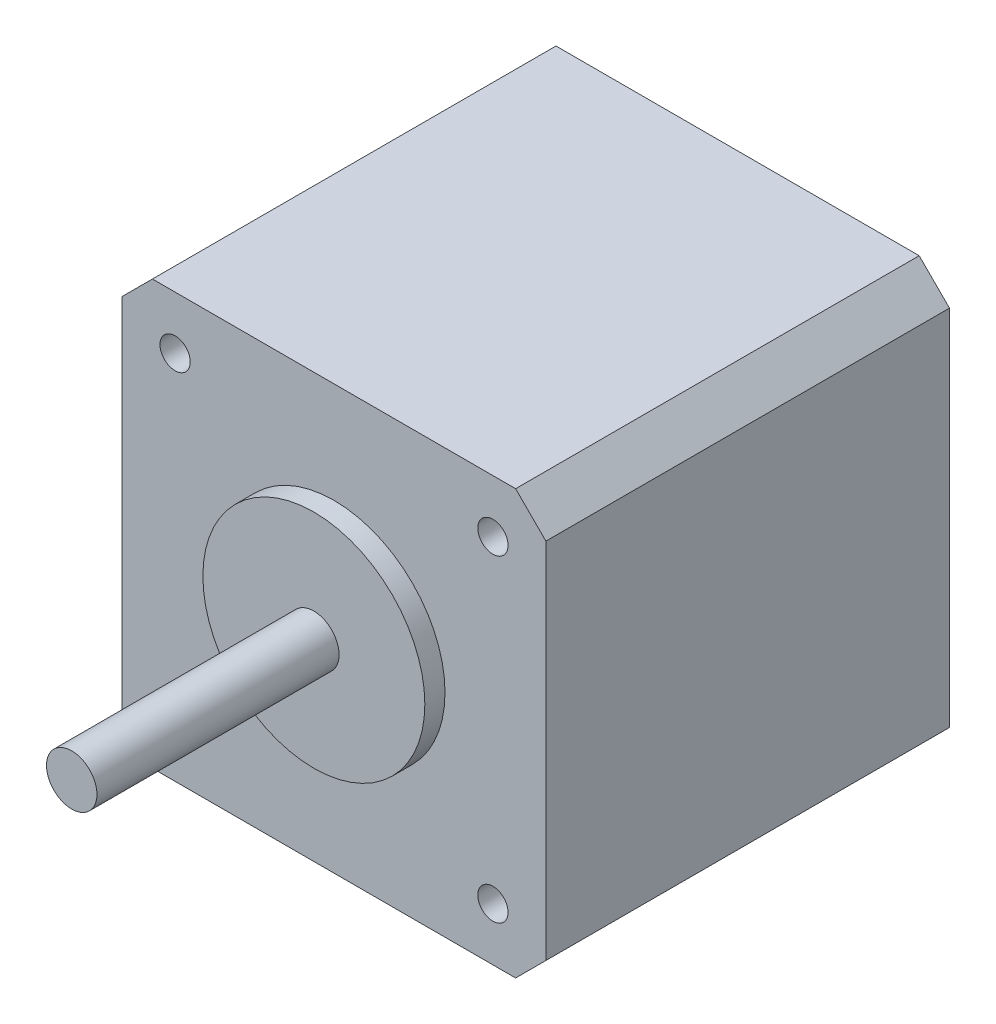
ISO-10303-21;
HEADER;
FILE_DESCRIPTION(('STEP AP214'),'2;1');
FILE_NAME('part.step','',(''),(''),'','','');
FILE_SCHEMA(('AUTOMOTIVE_DESIGN { 1 0 10303 214 1 1 1 1 }'));
ENDSEC;
DATA;
#1=APPLICATION_CONTEXT('core data for automotive mechanical design processes');
#2=APPLICATION_PROTOCOL_DEFINITION('international standard','automotive_design',2000,#1);
#3=PRODUCT_CONTEXT('',#1,'mechanical');
#4=PRODUCT('Part','Part','',(#3));
#5=PRODUCT_RELATED_PRODUCT_CATEGORY('part','',(#4));
#6=PRODUCT_DEFINITION_FORMATION('','',#4);
#7=PRODUCT_DEFINITION_CONTEXT('part definition',#1,'design');
#8=PRODUCT_DEFINITION('design','',#6,#7);
#9=PRODUCT_DEFINITION_SHAPE('','',#8);
#10=(LENGTH_UNIT() NAMED_UNIT(*) SI_UNIT(.MILLI.,.METRE.));
#11=(NAMED_UNIT(*) PLANE_ANGLE_UNIT() SI_UNIT($,.RADIAN.));
#12=(NAMED_UNIT(*) SI_UNIT($,.STERADIAN.) SOLID_ANGLE_UNIT());
#13=UNCERTAINTY_MEASURE_WITH_UNIT(LENGTH_MEASURE(1.E-05),#10,'distance_accuracy_value','');
#14=(GEOMETRIC_REPRESENTATION_CONTEXT(3) GLOBAL_UNCERTAINTY_ASSIGNED_CONTEXT((#13)) GLOBAL_UNIT_ASSIGNED_CONTEXT((#10,
#11,#12)) REPRESENTATION_CONTEXT('',''));
#15=CARTESIAN_POINT('',(0.,0.,0.));
#16=DIRECTION('',(0.,0.,1.));
#17=DIRECTION('',(1.,0.,0.));
#18=AXIS2_PLACEMENT_3D('',#15,#16,#17);
#19=CARTESIAN_POINT('',(0.,0.,42.));
#20=DIRECTION('',(0.,0.,1.));
#21=DIRECTION('',(1.,0.,0.));
#22=AXIS2_PLACEMENT_3D('',#19,#20,#21);
#23=PLANE('',#22);
#24=CARTESIAN_POINT('',(0.,0.,42.));
#25=DIRECTION('',(0.,0.,1.));
#26=DIRECTION('',(1.,0.,0.));
#27=AXIS2_PLACEMENT_3D('',#24,#25,#26);
#28=CIRCLE('',#27,11.);
#29=CARTESIAN_POINT('',(11.,0.,42.));
#30=VERTEX_POINT('',#29);
#31=EDGE_CURVE('E164',#30,#30,#28,.T.);
#32=ORIENTED_EDGE('',*,*,#31,.T.);
#33=EDGE_LOOP('',(#32));
#34=FACE_BOUND('',#33,.T.);
#35=CARTESIAN_POINT('',(0.,0.,42.));
#36=DIRECTION('',(0.,0.,1.));
#37=DIRECTION('',(1.,0.,0.));
#38=AXIS2_PLACEMENT_3D('',#35,#36,#37);
#39=CIRCLE('',#38,2.5);
#40=CARTESIAN_POINT('',(2.5,0.,42.));
#41=VERTEX_POINT('',#40);
#42=EDGE_CURVE('E178',#41,#41,#39,.T.);
#43=ORIENTED_EDGE('',*,*,#42,.F.);
#44=EDGE_LOOP('',(#43));
#45=FACE_BOUND('',#44,.T.);
#46=ADVANCED_FACE('F34',(#34,#45),#23,.T.);
#47=CARTESIAN_POINT('',(0.,0.,40.));
#48=DIRECTION('',(0.,0.,1.));
#49=DIRECTION('',(1.,0.,0.));
#50=AXIS2_PLACEMENT_3D('',#47,#48,#49);
#51=PLANE('',#50);
#52=CARTESIAN_POINT('',(15.75,-15.75,40.));
#53=DIRECTION('',(0.,0.,1.));
#54=DIRECTION('',(1.,0.,0.));
#55=AXIS2_PLACEMENT_3D('',#52,#53,#54);
#56=CIRCLE('',#55,1.5);
#57=CARTESIAN_POINT('',(17.25,-15.75,40.));
#58=VERTEX_POINT('',#57);
#59=EDGE_CURVE('E202',#58,#58,#56,.T.);
#60=ORIENTED_EDGE('',*,*,#59,.F.);
#61=EDGE_LOOP('',(#60));
#62=FACE_BOUND('',#61,.T.);
#63=CARTESIAN_POINT('',(-15.75,-15.75,40.));
#64=DIRECTION('',(0.,0.,1.));
#65=DIRECTION('',(1.,0.,0.));
#66=AXIS2_PLACEMENT_3D('',#63,#64,#65);
#67=CIRCLE('',#66,1.5);
#68=CARTESIAN_POINT('',(-14.25,-15.75,40.));
#69=VERTEX_POINT('',#68);
#70=EDGE_CURVE('E196',#69,#69,#67,.T.);
#71=ORIENTED_EDGE('',*,*,#70,.F.);
#72=EDGE_LOOP('',(#71));
#73=FACE_BOUND('',#72,.T.);
#74=CARTESIAN_POINT('',(15.75,15.75,40.));
#75=DIRECTION('',(0.,0.,1.));
#76=DIRECTION('',(1.,0.,0.));
#77=AXIS2_PLACEMENT_3D('',#74,#75,#76);
#78=CIRCLE('',#77,1.5);
#79=CARTESIAN_POINT('',(17.25,15.75,40.));
#80=VERTEX_POINT('',#79);
#81=EDGE_CURVE('E190',#80,#80,#78,.T.);
#82=ORIENTED_EDGE('',*,*,#81,.F.);
#83=EDGE_LOOP('',(#82));
#84=FACE_BOUND('',#83,.T.);
#85=CARTESIAN_POINT('',(-15.75,15.75,40.));
#86=DIRECTION('',(0.,0.,1.));
#87=DIRECTION('',(1.,0.,0.));
#88=AXIS2_PLACEMENT_3D('',#85,#86,#87);
#89=CIRCLE('',#88,1.5);
#90=CARTESIAN_POINT('',(-14.25,15.75,40.));
#91=VERTEX_POINT('',#90);
#92=EDGE_CURVE('E184',#91,#91,#89,.T.);
#93=ORIENTED_EDGE('',*,*,#92,.F.);
#94=EDGE_LOOP('',(#93));
#95=FACE_BOUND('',#94,.T.);
#96=DIRECTION('',(0.,-1.,0.));
#97=VECTOR('',#96,1.);
#98=CARTESIAN_POINT('',(-21.,21.,40.));
#99=LINE('',#98,#97);
#100=CARTESIAN_POINT('',(-21.,18.,40.));
#101=VERTEX_POINT('',#100);
#102=CARTESIAN_POINT('',(-21.,-18.,40.));
#103=VERTEX_POINT('',#102);
#104=EDGE_CURVE('E171',#101,#103,#99,.T.);
#105=ORIENTED_EDGE('',*,*,#104,.T.);
#106=DIRECTION('',(-0.707106781186546,0.707106781186549,0.));
#107=VECTOR('',#106,1.);
#108=CARTESIAN_POINT('',(-19.5,-19.5,40.));
#109=LINE('',#108,#107);
#110=CARTESIAN_POINT('',(-18.,-21.,40.));
#111=VERTEX_POINT('',#110);
#112=EDGE_CURVE('E148',#103,#111,#109,.F.);
#113=ORIENTED_EDGE('',*,*,#112,.T.);
#114=DIRECTION('',(1.,0.,0.));
#115=VECTOR('',#114,1.);
#116=CARTESIAN_POINT('',(-21.,-21.,40.));
#117=LINE('',#116,#115);
#118=CARTESIAN_POINT('',(18.,-21.,40.));
#119=VERTEX_POINT('',#118);
#120=EDGE_CURVE('E120',#111,#119,#117,.T.);
#121=ORIENTED_EDGE('',*,*,#120,.T.);
#122=DIRECTION('',(-0.707106781186549,-0.707106781186546,0.));
#123=VECTOR('',#122,1.);
#124=CARTESIAN_POINT('',(19.5,-19.5000000000001,40.));
#125=LINE('',#124,#123);
#126=CARTESIAN_POINT('',(21.,-18.,40.));
#127=VERTEX_POINT('',#126);
#128=EDGE_CURVE('E146',#119,#127,#125,.F.);
#129=ORIENTED_EDGE('',*,*,#128,.T.);
#130=DIRECTION('',(0.,1.,0.));
#131=VECTOR('',#130,1.);
#132=CARTESIAN_POINT('',(21.,21.,40.));
#133=LINE('',#132,#131);
#134=CARTESIAN_POINT('',(21.,18.,40.));
#135=VERTEX_POINT('',#134);
#136=EDGE_CURVE('E126',#127,#135,#133,.T.);
#137=ORIENTED_EDGE('',*,*,#136,.T.);
#138=DIRECTION('',(0.707106781186546,-0.707106781186549,0.));
#139=VECTOR('',#138,1.);
#140=CARTESIAN_POINT('',(19.5,19.4999999999999,40.));
#141=LINE('',#140,#139);
#142=CARTESIAN_POINT('',(18.,21.,40.));
#143=VERTEX_POINT('',#142);
#144=EDGE_CURVE('E55',#135,#143,#141,.F.);
#145=ORIENTED_EDGE('',*,*,#144,.T.);
#146=DIRECTION('',(-1.,0.,0.));
#147=VECTOR('',#146,1.);
#148=CARTESIAN_POINT('',(-21.,21.,40.));
#149=LINE('',#148,#147);
#150=CARTESIAN_POINT('',(-18.,21.,40.));
#151=VERTEX_POINT('',#150);
#152=EDGE_CURVE('E129',#143,#151,#149,.T.);
#153=ORIENTED_EDGE('',*,*,#152,.T.);
#154=DIRECTION('',(0.707106781186548,0.707106781186548,0.));
#155=VECTOR('',#154,1.);
#156=CARTESIAN_POINT('',(-19.5,19.5,40.));
#157=LINE('',#156,#155);
#158=EDGE_CURVE('E143',#151,#101,#157,.F.);
#159=ORIENTED_EDGE('',*,*,#158,.T.);
#160=EDGE_LOOP('',(#105,#113,#121,#129,#137,#145,#153,#159));
#161=FACE_BOUND('',#160,.T.);
#162=CARTESIAN_POINT('',(0.,0.,40.));
#163=DIRECTION('',(0.,0.,1.));
#164=DIRECTION('',(1.,0.,0.));
#165=AXIS2_PLACEMENT_3D('',#162,#163,#164);
#166=CIRCLE('',#165,11.);
#167=CARTESIAN_POINT('',(11.,0.,40.));
#168=VERTEX_POINT('',#167);
#169=EDGE_CURVE('E167',#168,#168,#166,.T.);
#170=ORIENTED_EDGE('',*,*,#169,.F.);
#171=EDGE_LOOP('',(#170));
#172=FACE_BOUND('',#171,.T.);
#173=ADVANCED_FACE('F217',(#62,#73,#84,#95,#161,#172),#51,.T.);
#174=CARTESIAN_POINT('',(21.,21.,40.));
#175=DIRECTION('',(-1.,0.,0.));
#176=DIRECTION('',(0.,-1.,0.));
#177=AXIS2_PLACEMENT_3D('',#174,#175,#176);
#178=PLANE('',#177);
#179=ORIENTED_EDGE('',*,*,#136,.F.);
#180=DIRECTION('',(0.,0.,-1.));
#181=VECTOR('',#180,1.);
#182=CARTESIAN_POINT('',(21.,-18.,40.));
#183=LINE('',#182,#181);
#184=CARTESIAN_POINT('',(21.,-18.,0.));
#185=VERTEX_POINT('',#184);
#186=EDGE_CURVE('E152',#127,#185,#183,.T.);
#187=ORIENTED_EDGE('',*,*,#186,.T.);
#188=DIRECTION('',(0.,1.,0.));
#189=VECTOR('',#188,1.);
#190=CARTESIAN_POINT('',(21.,21.,0.));
#191=LINE('',#190,#189);
#192=CARTESIAN_POINT('',(21.,18.,0.));
#193=VERTEX_POINT('',#192);
#194=EDGE_CURVE('E159',#185,#193,#191,.T.);
#195=ORIENTED_EDGE('',*,*,#194,.T.);
#196=DIRECTION('',(0.,0.,1.));
#197=VECTOR('',#196,1.);
#198=CARTESIAN_POINT('',(21.,18.,40.));
#199=LINE('',#198,#197);
#200=EDGE_CURVE('E150',#193,#135,#199,.T.);
#201=ORIENTED_EDGE('',*,*,#200,.T.);
#202=EDGE_LOOP('',(#179,#187,#195,#201));
#203=FACE_BOUND('',#202,.T.);
#204=ADVANCED_FACE('F158',(#203),#178,.F.);
#205=CARTESIAN_POINT('',(-21.,21.,40.));
#206=DIRECTION('',(0.,-1.,0.));
#207=DIRECTION('',(0.,0.,-1.));
#208=AXIS2_PLACEMENT_3D('',#205,#206,#207);
#209=PLANE('',#208);
#210=ORIENTED_EDGE('',*,*,#152,.F.);
#211=DIRECTION('',(0.,0.,-1.));
#212=VECTOR('',#211,1.);
#213=CARTESIAN_POINT('',(18.,21.,40.));
#214=LINE('',#213,#212);
#215=CARTESIAN_POINT('',(18.,21.,0.));
#216=VERTEX_POINT('',#215);
#217=EDGE_CURVE('E11',#143,#216,#214,.T.);
#218=ORIENTED_EDGE('',*,*,#217,.T.);
#219=DIRECTION('',(-1.,0.,0.));
#220=VECTOR('',#219,1.);
#221=CARTESIAN_POINT('',(-21.,21.,0.));
#222=LINE('',#221,#220);
#223=CARTESIAN_POINT('',(-18.,21.,0.));
#224=VERTEX_POINT('',#223);
#225=EDGE_CURVE('E131',#216,#224,#222,.T.);
#226=ORIENTED_EDGE('',*,*,#225,.T.);
#227=DIRECTION('',(0.,0.,1.));
#228=VECTOR('',#227,1.);
#229=CARTESIAN_POINT('',(-18.,21.,40.));
#230=LINE('',#229,#228);
#231=EDGE_CURVE('E42',#224,#151,#230,.T.);
#232=ORIENTED_EDGE('',*,*,#231,.T.);
#233=EDGE_LOOP('',(#210,#218,#226,#232));
#234=FACE_BOUND('',#233,.T.);
#235=ADVANCED_FACE('F379',(#234),#209,.F.);
#236=CARTESIAN_POINT('',(-21.,21.,40.));
#237=DIRECTION('',(1.,0.,0.));
#238=DIRECTION('',(0.,1.,0.));
#239=AXIS2_PLACEMENT_3D('',#236,#237,#238);
#240=PLANE('',#239);
#241=DIRECTION('',(0.,-1.,0.));
#242=VECTOR('',#241,1.);
#243=CARTESIAN_POINT('',(-21.,21.,0.));
#244=LINE('',#243,#242);
#245=CARTESIAN_POINT('',(-21.,18.,0.));
#246=VERTEX_POINT('',#245);
#247=CARTESIAN_POINT('',(-21.,-18.,0.));
#248=VERTEX_POINT('',#247);
#249=EDGE_CURVE('E127',#246,#248,#244,.T.);
#250=ORIENTED_EDGE('',*,*,#249,.T.);
#251=DIRECTION('',(0.,0.,1.));
#252=VECTOR('',#251,1.);
#253=CARTESIAN_POINT('',(-21.,-18.,40.));
#254=LINE('',#253,#252);
#255=EDGE_CURVE('E105',#248,#103,#254,.T.);
#256=ORIENTED_EDGE('',*,*,#255,.T.);
#257=ORIENTED_EDGE('',*,*,#104,.F.);
#258=DIRECTION('',(0.,0.,-1.));
#259=VECTOR('',#258,1.);
#260=CARTESIAN_POINT('',(-21.,18.,40.));
#261=LINE('',#260,#259);
#262=EDGE_CURVE('E110',#101,#246,#261,.T.);
#263=ORIENTED_EDGE('',*,*,#262,.T.);
#264=EDGE_LOOP('',(#250,#256,#257,#263));
#265=FACE_BOUND('',#264,.T.);
#266=ADVANCED_FACE('F371',(#265),#240,.F.);
#267=CARTESIAN_POINT('',(-21.,-21.,40.));
#268=DIRECTION('',(0.,1.,0.));
#269=DIRECTION('',(0.,0.,1.));
#270=AXIS2_PLACEMENT_3D('',#267,#268,#269);
#271=PLANE('',#270);
#272=ORIENTED_EDGE('',*,*,#120,.F.);
#273=DIRECTION('',(0.,0.,-1.));
#274=VECTOR('',#273,1.);
#275=CARTESIAN_POINT('',(-18.,-21.,40.));
#276=LINE('',#275,#274);
#277=CARTESIAN_POINT('',(-18.,-21.,0.));
#278=VERTEX_POINT('',#277);
#279=EDGE_CURVE('E104',#111,#278,#276,.T.);
#280=ORIENTED_EDGE('',*,*,#279,.T.);
#281=DIRECTION('',(1.,0.,0.));
#282=VECTOR('',#281,1.);
#283=CARTESIAN_POINT('',(-21.,-21.,0.));
#284=LINE('',#283,#282);
#285=CARTESIAN_POINT('',(18.,-21.,0.));
#286=VERTEX_POINT('',#285);
#287=EDGE_CURVE('E117',#278,#286,#284,.T.);
#288=ORIENTED_EDGE('',*,*,#287,.T.);
#289=DIRECTION('',(0.,0.,1.));
#290=VECTOR('',#289,1.);
#291=CARTESIAN_POINT('',(18.,-21.,40.));
#292=LINE('',#291,#290);
#293=EDGE_CURVE('E122',#286,#119,#292,.T.);
#294=ORIENTED_EDGE('',*,*,#293,.T.);
#295=EDGE_LOOP('',(#272,#280,#288,#294));
#296=FACE_BOUND('',#295,.T.);
#297=ADVANCED_FACE('F116',(#296),#271,.F.);
#298=CARTESIAN_POINT('',(0.,0.,0.));
#299=DIRECTION('',(0.,0.,1.));
#300=DIRECTION('',(1.,0.,0.));
#301=AXIS2_PLACEMENT_3D('',#298,#299,#300);
#302=PLANE('',#301);
#303=ORIENTED_EDGE('',*,*,#287,.F.);
#304=DIRECTION('',(0.707106781186546,-0.707106781186549,0.));
#305=VECTOR('',#304,1.);
#306=CARTESIAN_POINT('',(-18.,-21.,0.));
#307=LINE('',#306,#305);
#308=EDGE_CURVE('E100',#278,#248,#307,.F.);
#309=ORIENTED_EDGE('',*,*,#308,.T.);
#310=ORIENTED_EDGE('',*,*,#249,.F.);
#311=DIRECTION('',(-0.707106781186548,-0.707106781186548,0.));
#312=VECTOR('',#311,1.);
#313=CARTESIAN_POINT('',(-21.,18.,0.));
#314=LINE('',#313,#312);
#315=EDGE_CURVE('E121',#246,#224,#314,.F.);
#316=ORIENTED_EDGE('',*,*,#315,.T.);
#317=ORIENTED_EDGE('',*,*,#225,.F.);
#318=DIRECTION('',(-0.707106781186546,0.707106781186549,0.));
#319=VECTOR('',#318,1.);
#320=CARTESIAN_POINT('',(18.,21.,0.));
#321=LINE('',#320,#319);
#322=EDGE_CURVE('E137',#216,#193,#321,.F.);
#323=ORIENTED_EDGE('',*,*,#322,.T.);
#324=ORIENTED_EDGE('',*,*,#194,.F.);
#325=DIRECTION('',(0.707106781186549,0.707106781186546,0.));
#326=VECTOR('',#325,1.);
#327=CARTESIAN_POINT('',(21.,-18.,0.));
#328=LINE('',#327,#326);
#329=EDGE_CURVE('E111',#185,#286,#328,.F.);
#330=ORIENTED_EDGE('',*,*,#329,.T.);
#331=EDGE_LOOP('',(#303,#309,#310,#316,#317,#323,#324,#330));
#332=FACE_BOUND('',#331,.T.);
#333=ADVANCED_FACE('F124',(#332),#302,.F.);
#334=CARTESIAN_POINT('',(0.,0.,42.));
#335=DIRECTION('',(0.,0.,-1.));
#336=DIRECTION('',(-1.,0.,0.));
#337=AXIS2_PLACEMENT_3D('',#334,#335,#336);
#338=CYLINDRICAL_SURFACE('',#337,11.);
#339=ORIENTED_EDGE('',*,*,#31,.F.);
#340=EDGE_LOOP('',(#339));
#341=FACE_BOUND('',#340,.T.);
#342=ORIENTED_EDGE('',*,*,#169,.T.);
#343=EDGE_LOOP('',(#342));
#344=FACE_BOUND('',#343,.T.);
#345=ADVANCED_FACE('F230',(#341,#344),#338,.T.);
#346=CARTESIAN_POINT('',(0.,0.,66.));
#347=DIRECTION('',(0.,0.,-1.));
#348=DIRECTION('',(-1.,0.,0.));
#349=AXIS2_PLACEMENT_3D('',#346,#347,#348);
#350=CYLINDRICAL_SURFACE('',#349,2.5);
#351=CARTESIAN_POINT('',(0.,0.,66.));
#352=DIRECTION('',(0.,0.,1.));
#353=DIRECTION('',(1.,0.,0.));
#354=AXIS2_PLACEMENT_3D('',#351,#352,#353);
#355=CIRCLE('',#354,2.5);
#356=CARTESIAN_POINT('',(2.5,0.,66.));
#357=VERTEX_POINT('',#356);
#358=EDGE_CURVE('E176',#357,#357,#355,.T.);
#359=ORIENTED_EDGE('',*,*,#358,.F.);
#360=EDGE_LOOP('',(#359));
#361=FACE_BOUND('',#360,.T.);
#362=ORIENTED_EDGE('',*,*,#42,.T.);
#363=EDGE_LOOP('',(#362));
#364=FACE_BOUND('',#363,.T.);
#365=ADVANCED_FACE('F232',(#361,#364),#350,.T.);
#366=CARTESIAN_POINT('',(0.,0.,66.));
#367=DIRECTION('',(0.,0.,1.));
#368=DIRECTION('',(1.,0.,0.));
#369=AXIS2_PLACEMENT_3D('',#366,#367,#368);
#370=PLANE('',#369);
#371=ORIENTED_EDGE('',*,*,#358,.T.);
#372=EDGE_LOOP('',(#371));
#373=FACE_BOUND('',#372,.T.);
#374=ADVANCED_FACE('F239',(#373),#370,.T.);
#375=CARTESIAN_POINT('',(-18.,-21.,40.));
#376=DIRECTION('',(0.707106781186549,0.707106781186546,0.));
#377=DIRECTION('',(0.,0.,-1.));
#378=AXIS2_PLACEMENT_3D('',#375,#376,#377);
#379=PLANE('',#378);
#380=ORIENTED_EDGE('',*,*,#112,.F.);
#381=ORIENTED_EDGE('',*,*,#255,.F.);
#382=ORIENTED_EDGE('',*,*,#308,.F.);
#383=ORIENTED_EDGE('',*,*,#279,.F.);
#384=EDGE_LOOP('',(#380,#381,#382,#383));
#385=FACE_BOUND('',#384,.T.);
#386=ADVANCED_FACE('F103',(#385),#379,.F.);
#387=CARTESIAN_POINT('',(21.,-18.,40.));
#388=DIRECTION('',(-0.707106781186546,0.707106781186549,0.));
#389=DIRECTION('',(0.,0.,-1.));
#390=AXIS2_PLACEMENT_3D('',#387,#388,#389);
#391=PLANE('',#390);
#392=ORIENTED_EDGE('',*,*,#128,.F.);
#393=ORIENTED_EDGE('',*,*,#293,.F.);
#394=ORIENTED_EDGE('',*,*,#329,.F.);
#395=ORIENTED_EDGE('',*,*,#186,.F.);
#396=EDGE_LOOP('',(#392,#393,#394,#395));
#397=FACE_BOUND('',#396,.T.);
#398=ADVANCED_FACE('F322',(#397),#391,.F.);
#399=CARTESIAN_POINT('',(18.,21.,40.));
#400=DIRECTION('',(-0.707106781186549,-0.707106781186546,0.));
#401=DIRECTION('',(0.,0.,-1.));
#402=AXIS2_PLACEMENT_3D('',#399,#400,#401);
#403=PLANE('',#402);
#404=ORIENTED_EDGE('',*,*,#144,.F.);
#405=ORIENTED_EDGE('',*,*,#200,.F.);
#406=ORIENTED_EDGE('',*,*,#322,.F.);
#407=ORIENTED_EDGE('',*,*,#217,.F.);
#408=EDGE_LOOP('',(#404,#405,#406,#407));
#409=FACE_BOUND('',#408,.T.);
#410=ADVANCED_FACE('F315',(#409),#403,.F.);
#411=CARTESIAN_POINT('',(-21.,18.,40.));
#412=DIRECTION('',(0.707106781186547,-0.707106781186547,0.));
#413=DIRECTION('',(0.,0.,-1.));
#414=AXIS2_PLACEMENT_3D('',#411,#412,#413);
#415=PLANE('',#414);
#416=ORIENTED_EDGE('',*,*,#158,.F.);
#417=ORIENTED_EDGE('',*,*,#231,.F.);
#418=ORIENTED_EDGE('',*,*,#315,.F.);
#419=ORIENTED_EDGE('',*,*,#262,.F.);
#420=EDGE_LOOP('',(#416,#417,#418,#419));
#421=FACE_BOUND('',#420,.T.);
#422=ADVANCED_FACE('F36',(#421),#415,.F.);
#423=CARTESIAN_POINT('',(-15.75,15.75,30.));
#424=DIRECTION('',(0.,0.,1.));
#425=DIRECTION('',(1.,0.,0.));
#426=AXIS2_PLACEMENT_3D('',#423,#424,#425);
#427=CYLINDRICAL_SURFACE('',#426,1.5);
#428=CARTESIAN_POINT('',(-15.75,15.75,30.));
#429=DIRECTION('',(0.,0.,1.));
#430=DIRECTION('',(1.,0.,0.));
#431=AXIS2_PLACEMENT_3D('',#428,#429,#430);
#432=CIRCLE('',#431,1.5);
#433=CARTESIAN_POINT('',(-14.25,15.75,30.));
#434=VERTEX_POINT('',#433);
#435=EDGE_CURVE('E181',#434,#434,#432,.T.);
#436=ORIENTED_EDGE('',*,*,#435,.F.);
#437=EDGE_LOOP('',(#436));
#438=FACE_BOUND('',#437,.T.);
#439=ORIENTED_EDGE('',*,*,#92,.T.);
#440=EDGE_LOOP('',(#439));
#441=FACE_BOUND('',#440,.T.);
#442=ADVANCED_FACE('F254',(#438,#441),#427,.F.);
#443=CARTESIAN_POINT('',(-15.75,15.75,30.));
#444=DIRECTION('',(0.,0.,1.));
#445=DIRECTION('',(1.,0.,0.));
#446=AXIS2_PLACEMENT_3D('',#443,#444,#445);
#447=PLANE('',#446);
#448=ORIENTED_EDGE('',*,*,#435,.T.);
#449=EDGE_LOOP('',(#448));
#450=FACE_BOUND('',#449,.T.);
#451=ADVANCED_FACE('F257',(#450),#447,.T.);
#452=CARTESIAN_POINT('',(15.75,15.75,30.));
#453=DIRECTION('',(0.,0.,1.));
#454=DIRECTION('',(1.,0.,0.));
#455=AXIS2_PLACEMENT_3D('',#452,#453,#454);
#456=CYLINDRICAL_SURFACE('',#455,1.5);
#457=CARTESIAN_POINT('',(15.75,15.75,30.));
#458=DIRECTION('',(0.,0.,1.));
#459=DIRECTION('',(1.,0.,0.));
#460=AXIS2_PLACEMENT_3D('',#457,#458,#459);
#461=CIRCLE('',#460,1.5);
#462=CARTESIAN_POINT('',(17.25,15.75,30.));
#463=VERTEX_POINT('',#462);
#464=EDGE_CURVE('E187',#463,#463,#461,.T.);
#465=ORIENTED_EDGE('',*,*,#464,.F.);
#466=EDGE_LOOP('',(#465));
#467=FACE_BOUND('',#466,.T.);
#468=ORIENTED_EDGE('',*,*,#81,.T.);
#469=EDGE_LOOP('',(#468));
#470=FACE_BOUND('',#469,.T.);
#471=ADVANCED_FACE('F261',(#467,#470),#456,.F.);
#472=CARTESIAN_POINT('',(15.75,15.75,30.));
#473=DIRECTION('',(0.,0.,1.));
#474=DIRECTION('',(1.,0.,0.));
#475=AXIS2_PLACEMENT_3D('',#472,#473,#474);
#476=PLANE('',#475);
#477=ORIENTED_EDGE('',*,*,#464,.T.);
#478=EDGE_LOOP('',(#477));
#479=FACE_BOUND('',#478,.T.);
#480=ADVANCED_FACE('F265',(#479),#476,.T.);
#481=CARTESIAN_POINT('',(-15.75,-15.75,30.));
#482=DIRECTION('',(0.,0.,1.));
#483=DIRECTION('',(1.,0.,0.));
#484=AXIS2_PLACEMENT_3D('',#481,#482,#483);
#485=CYLINDRICAL_SURFACE('',#484,1.5);
#486=CARTESIAN_POINT('',(-15.75,-15.75,30.));
#487=DIRECTION('',(0.,0.,1.));
#488=DIRECTION('',(1.,0.,0.));
#489=AXIS2_PLACEMENT_3D('',#486,#487,#488);
#490=CIRCLE('',#489,1.5);
#491=CARTESIAN_POINT('',(-14.25,-15.75,30.));
#492=VERTEX_POINT('',#491);
#493=EDGE_CURVE('E193',#492,#492,#490,.T.);
#494=ORIENTED_EDGE('',*,*,#493,.F.);
#495=EDGE_LOOP('',(#494));
#496=FACE_BOUND('',#495,.T.);
#497=ORIENTED_EDGE('',*,*,#70,.T.);
#498=EDGE_LOOP('',(#497));
#499=FACE_BOUND('',#498,.T.);
#500=ADVANCED_FACE('F269',(#496,#499),#485,.F.);
#501=CARTESIAN_POINT('',(-15.75,-15.75,30.));
#502=DIRECTION('',(0.,0.,1.));
#503=DIRECTION('',(1.,0.,0.));
#504=AXIS2_PLACEMENT_3D('',#501,#502,#503);
#505=PLANE('',#504);
#506=ORIENTED_EDGE('',*,*,#493,.T.);
#507=EDGE_LOOP('',(#506));
#508=FACE_BOUND('',#507,.T.);
#509=ADVANCED_FACE('F213',(#508),#505,.T.);
#510=CARTESIAN_POINT('',(15.75,-15.75,30.));
#511=DIRECTION('',(0.,0.,1.));
#512=DIRECTION('',(1.,0.,0.));
#513=AXIS2_PLACEMENT_3D('',#510,#511,#512);
#514=CYLINDRICAL_SURFACE('',#513,1.5);
#515=CARTESIAN_POINT('',(15.75,-15.75,30.));
#516=DIRECTION('',(0.,0.,1.));
#517=DIRECTION('',(1.,0.,0.));
#518=AXIS2_PLACEMENT_3D('',#515,#516,#517);
#519=CIRCLE('',#518,1.5);
#520=CARTESIAN_POINT('',(17.25,-15.75,30.));
#521=VERTEX_POINT('',#520);
#522=EDGE_CURVE('E199',#521,#521,#519,.T.);
#523=ORIENTED_EDGE('',*,*,#522,.F.);
#524=EDGE_LOOP('',(#523));
#525=FACE_BOUND('',#524,.T.);
#526=ORIENTED_EDGE('',*,*,#59,.T.);
#527=EDGE_LOOP('',(#526));
#528=FACE_BOUND('',#527,.T.);
#529=ADVANCED_FACE('F210',(#525,#528),#514,.F.);
#530=CARTESIAN_POINT('',(15.75,-15.75,30.));
#531=DIRECTION('',(0.,0.,1.));
#532=DIRECTION('',(1.,0.,0.));
#533=AXIS2_PLACEMENT_3D('',#530,#531,#532);
#534=PLANE('',#533);
#535=ORIENTED_EDGE('',*,*,#522,.T.);
#536=EDGE_LOOP('',(#535));
#537=FACE_BOUND('',#536,.T.);
#538=ADVANCED_FACE('F208',(#537),#534,.T.);
#539=CLOSED_SHELL('',(#46,#173,#204,#235,#266,#297,#333,#345,#365,#374,#386,#398,#410,#422,#442,
#451,#471,#480,#500,#509,#529,#538));
#540=MANIFOLD_SOLID_BREP('B2',#539);
#541=ADVANCED_BREP_SHAPE_REPRESENTATION('',(#18,#540),#14);
#542=SHAPE_DEFINITION_REPRESENTATION(#9,#541);
ENDSEC;
END-ISO-10303-21;
